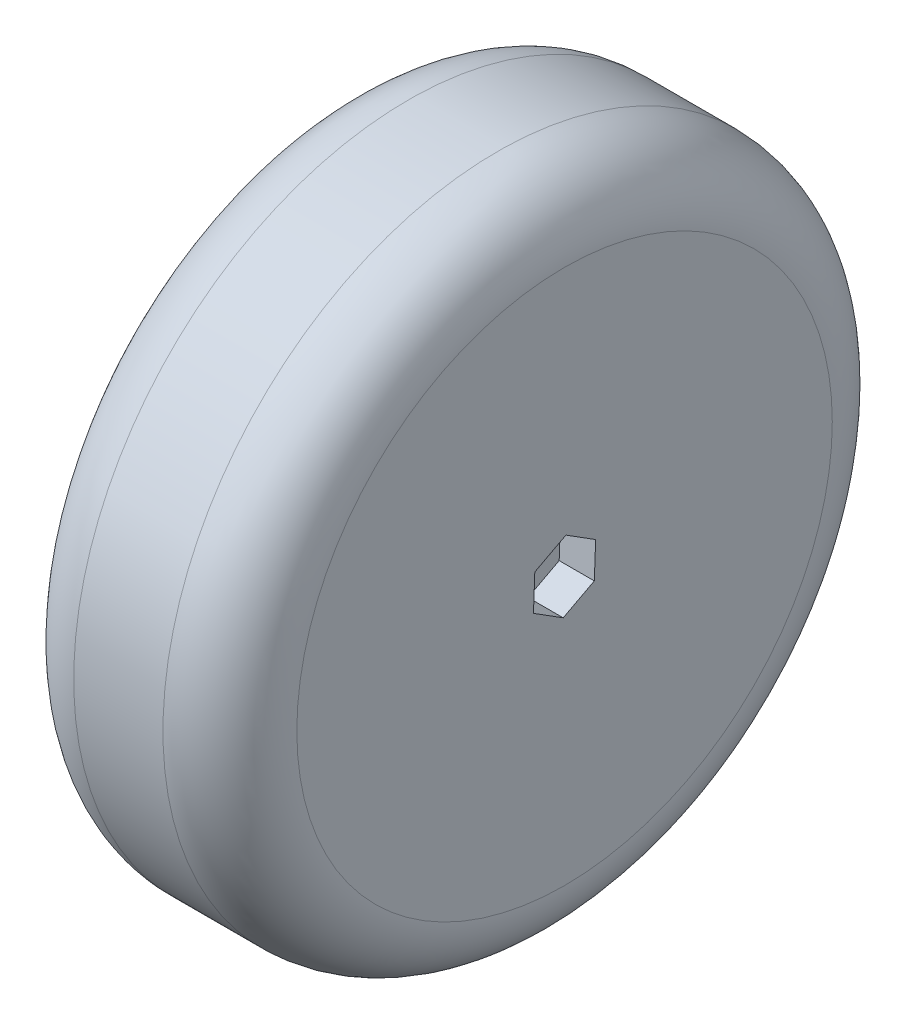
ISO-10303-21;
HEADER;
FILE_DESCRIPTION(('STEP AP214'),'2;1');
FILE_NAME('part.step','',(''),(''),'','','');
FILE_SCHEMA(('AUTOMOTIVE_DESIGN { 1 0 10303 214 1 1 1 1 }'));
ENDSEC;
DATA;
#1=APPLICATION_CONTEXT('core data for automotive mechanical design processes');
#2=APPLICATION_PROTOCOL_DEFINITION('international standard','automotive_design',2000,#1);
#3=PRODUCT_CONTEXT('',#1,'mechanical');
#4=PRODUCT('Part','Part','',(#3));
#5=PRODUCT_RELATED_PRODUCT_CATEGORY('part','',(#4));
#6=PRODUCT_DEFINITION_FORMATION('','',#4);
#7=PRODUCT_DEFINITION_CONTEXT('part definition',#1,'design');
#8=PRODUCT_DEFINITION('design','',#6,#7);
#9=PRODUCT_DEFINITION_SHAPE('','',#8);
#10=(LENGTH_UNIT() NAMED_UNIT(*) SI_UNIT(.MILLI.,.METRE.));
#11=(NAMED_UNIT(*) PLANE_ANGLE_UNIT() SI_UNIT($,.RADIAN.));
#12=(NAMED_UNIT(*) SI_UNIT($,.STERADIAN.) SOLID_ANGLE_UNIT());
#13=UNCERTAINTY_MEASURE_WITH_UNIT(LENGTH_MEASURE(1.E-05),#10,'distance_accuracy_value','');
#14=(GEOMETRIC_REPRESENTATION_CONTEXT(3) GLOBAL_UNCERTAINTY_ASSIGNED_CONTEXT((#13)) GLOBAL_UNIT_ASSIGNED_CONTEXT((#10,
#11,#12)) REPRESENTATION_CONTEXT('',''));
#15=CARTESIAN_POINT('',(0.,0.,0.));
#16=DIRECTION('',(0.,0.,1.));
#17=DIRECTION('',(1.,0.,0.));
#18=AXIS2_PLACEMENT_3D('',#15,#16,#17);
#19=CARTESIAN_POINT('',(0.,0.,0.));
#20=DIRECTION('',(1.,0.,0.));
#21=DIRECTION('',(0.,0.,-1.));
#22=AXIS2_PLACEMENT_3D('',#19,#20,#21);
#23=CYLINDRICAL_SURFACE('',#22,1.7);
#24=CARTESIAN_POINT('',(0.,0.,0.));
#25=DIRECTION('',(1.,0.,0.));
#26=DIRECTION('',(0.,0.,-1.));
#27=AXIS2_PLACEMENT_3D('',#24,#25,#26);
#28=CIRCLE('',#27,1.7);
#29=CARTESIAN_POINT('',(0.,0.,-1.7));
#30=VERTEX_POINT('',#29);
#31=EDGE_CURVE('E171',#30,#30,#28,.T.);
#32=ORIENTED_EDGE('',*,*,#31,.F.);
#33=EDGE_LOOP('',(#32));
#34=FACE_BOUND('',#33,.T.);
#35=CARTESIAN_POINT('',(21.4,0.,0.));
#36=DIRECTION('',(1.,0.,0.));
#37=DIRECTION('',(0.,0.,-1.));
#38=AXIS2_PLACEMENT_3D('',#35,#36,#37);
#39=CIRCLE('',#38,1.7);
#40=CARTESIAN_POINT('',(21.4,0.,-1.7));
#41=VERTEX_POINT('',#40);
#42=EDGE_CURVE('E49',#41,#41,#39,.F.);
#43=ORIENTED_EDGE('',*,*,#42,.F.);
#44=EDGE_LOOP('',(#43));
#45=FACE_BOUND('',#44,.T.);
#46=ADVANCED_FACE('F45',(#34,#45),#23,.F.);
#47=CARTESIAN_POINT('',(25.4,0.,0.));
#48=DIRECTION('',(-1.,0.,0.));
#49=DIRECTION('',(0.,0.,1.));
#50=AXIS2_PLACEMENT_3D('',#47,#48,#49);
#51=CYLINDRICAL_SURFACE('',#50,38.1);
#52=CARTESIAN_POINT('',(7.62,0.,0.));
#53=DIRECTION('',(1.,0.,0.));
#54=DIRECTION('',(0.,0.,-1.));
#55=AXIS2_PLACEMENT_3D('',#52,#53,#54);
#56=CIRCLE('',#55,38.1);
#57=CARTESIAN_POINT('',(7.62,0.,-38.1));
#58=VERTEX_POINT('',#57);
#59=EDGE_CURVE('E55',#58,#58,#56,.T.);
#60=ORIENTED_EDGE('',*,*,#59,.T.);
#61=EDGE_LOOP('',(#60));
#62=FACE_BOUND('',#61,.T.);
#63=CARTESIAN_POINT('',(17.78,0.,0.));
#64=DIRECTION('',(1.,0.,0.));
#65=DIRECTION('',(0.,0.,-1.));
#66=AXIS2_PLACEMENT_3D('',#63,#64,#65);
#67=CIRCLE('',#66,38.1);
#68=CARTESIAN_POINT('',(17.78,0.,-38.1));
#69=VERTEX_POINT('',#68);
#70=EDGE_CURVE('E179',#69,#69,#67,.F.);
#71=ORIENTED_EDGE('',*,*,#70,.T.);
#72=EDGE_LOOP('',(#71));
#73=FACE_BOUND('',#72,.T.);
#74=ADVANCED_FACE('F187',(#62,#73),#51,.T.);
#75=CARTESIAN_POINT('',(25.4,0.,0.));
#76=DIRECTION('',(1.,0.,0.));
#77=DIRECTION('',(0.,0.,-1.));
#78=AXIS2_PLACEMENT_3D('',#75,#76,#77);
#79=PLANE('',#78);
#80=DIRECTION('',(0.,-0.466452502191299,0.884546247066526));
#81=VECTOR('',#80,1.);
#82=CARTESIAN_POINT('',(25.4,3.99983047041812,-0.153359733680597));
#83=LINE('',#82,#81);
#84=CARTESIAN_POINT('',(25.4,3.99983047041812,-0.153359733680597));
#85=VERTEX_POINT('',#84);
#86=CARTESIAN_POINT('',(25.4,2.13272866049408,3.38727493137286));
#87=VERTEX_POINT('',#86);
#88=EDGE_CURVE('E62',#85,#87,#83,.T.);
#89=ORIENTED_EDGE('',*,*,#88,.F.);
#90=DIRECTION('',(0.,0.532813269686149,0.846232840089745));
#91=VECTOR('',#90,1.);
#92=CARTESIAN_POINT('',(25.4,1.86710180992405,-3.54063466505346));
#93=LINE('',#92,#91);
#94=CARTESIAN_POINT('',(25.4,1.86710180992405,-3.54063466505346));
#95=VERTEX_POINT('',#94);
#96=EDGE_CURVE('E156',#95,#85,#93,.T.);
#97=ORIENTED_EDGE('',*,*,#96,.F.);
#98=DIRECTION('',(0.,0.999265771877448,-0.0383134069767816));
#99=VECTOR('',#98,1.);
#100=CARTESIAN_POINT('',(25.4,-2.13272866049408,-3.38727493137286));
#101=LINE('',#100,#99);
#102=CARTESIAN_POINT('',(25.4,-2.13272866049408,-3.38727493137286));
#103=VERTEX_POINT('',#102);
#104=EDGE_CURVE('E153',#103,#95,#101,.T.);
#105=ORIENTED_EDGE('',*,*,#104,.F.);
#106=DIRECTION('',(0.,0.466452502191299,-0.884546247066526));
#107=VECTOR('',#106,1.);
#108=CARTESIAN_POINT('',(25.4,-3.99983047041813,0.153359733680597));
#109=LINE('',#108,#107);
#110=CARTESIAN_POINT('',(25.4,-3.99983047041813,0.153359733680597));
#111=VERTEX_POINT('',#110);
#112=EDGE_CURVE('E110',#111,#103,#109,.T.);
#113=ORIENTED_EDGE('',*,*,#112,.F.);
#114=DIRECTION('',(0.,-0.532813269686149,-0.846232840089745));
#115=VECTOR('',#114,1.);
#116=CARTESIAN_POINT('',(25.4,-1.86710180992405,3.54063466505346));
#117=LINE('',#116,#115);
#118=CARTESIAN_POINT('',(25.4,-1.86710180992405,3.54063466505346));
#119=VERTEX_POINT('',#118);
#120=EDGE_CURVE('E147',#119,#111,#117,.T.);
#121=ORIENTED_EDGE('',*,*,#120,.F.);
#122=DIRECTION('',(0.,-0.999265771877448,0.0383134069767817));
#123=VECTOR('',#122,1.);
#124=CARTESIAN_POINT('',(25.4,2.13272866049408,3.38727493137286));
#125=LINE('',#124,#123);
#126=EDGE_CURVE('E143',#87,#119,#125,.T.);
#127=ORIENTED_EDGE('',*,*,#126,.F.);
#128=EDGE_LOOP('',(#89,#97,#105,#113,#121,#127));
#129=FACE_BOUND('',#128,.T.);
#130=CARTESIAN_POINT('',(25.4,0.,0.));
#131=DIRECTION('',(1.,0.,0.));
#132=DIRECTION('',(0.,0.,-1.));
#133=AXIS2_PLACEMENT_3D('',#130,#131,#132);
#134=CIRCLE('',#133,30.48);
#135=CARTESIAN_POINT('',(25.4,0.,-30.48));
#136=VERTEX_POINT('',#135);
#137=EDGE_CURVE('E175',#136,#136,#134,.T.);
#138=ORIENTED_EDGE('',*,*,#137,.T.);
#139=EDGE_LOOP('',(#138));
#140=FACE_BOUND('',#139,.T.);
#141=ADVANCED_FACE('F210',(#129,#140),#79,.T.);
#142=CARTESIAN_POINT('',(0.,0.,0.));
#143=DIRECTION('',(1.,0.,0.));
#144=DIRECTION('',(0.,0.,-1.));
#145=AXIS2_PLACEMENT_3D('',#142,#143,#144);
#146=PLANE('',#145);
#147=ORIENTED_EDGE('',*,*,#31,.T.);
#148=EDGE_LOOP('',(#147));
#149=FACE_BOUND('',#148,.T.);
#150=CARTESIAN_POINT('',(0.,0.,0.));
#151=DIRECTION('',(1.,0.,0.));
#152=DIRECTION('',(0.,0.,-1.));
#153=AXIS2_PLACEMENT_3D('',#150,#151,#152);
#154=CIRCLE('',#153,30.48);
#155=CARTESIAN_POINT('',(0.,0.,-30.48));
#156=VERTEX_POINT('',#155);
#157=EDGE_CURVE('E11',#156,#156,#154,.F.);
#158=ORIENTED_EDGE('',*,*,#157,.T.);
#159=EDGE_LOOP('',(#158));
#160=FACE_BOUND('',#159,.T.);
#161=ADVANCED_FACE('F201',(#149,#160),#146,.F.);
#162=CARTESIAN_POINT('',(17.78,0.,0.));
#163=DIRECTION('',(1.,0.,0.));
#164=DIRECTION('',(0.,0.,-1.));
#165=AXIS2_PLACEMENT_3D('',#162,#163,#164);
#166=TOROIDAL_SURFACE('',#165,30.48,7.62);
#167=ORIENTED_EDGE('',*,*,#70,.F.);
#168=EDGE_LOOP('',(#167));
#169=FACE_BOUND('',#168,.T.);
#170=ORIENTED_EDGE('',*,*,#137,.F.);
#171=EDGE_LOOP('',(#170));
#172=FACE_BOUND('',#171,.T.);
#173=ADVANCED_FACE('F191',(#169,#172),#166,.T.);
#174=CARTESIAN_POINT('',(7.62,0.,0.));
#175=DIRECTION('',(1.,0.,0.));
#176=DIRECTION('',(0.,0.,-1.));
#177=AXIS2_PLACEMENT_3D('',#174,#175,#176);
#178=TOROIDAL_SURFACE('',#177,30.48,7.62);
#179=ORIENTED_EDGE('',*,*,#157,.F.);
#180=EDGE_LOOP('',(#179));
#181=FACE_BOUND('',#180,.T.);
#182=ORIENTED_EDGE('',*,*,#59,.F.);
#183=EDGE_LOOP('',(#182));
#184=FACE_BOUND('',#183,.T.);
#185=ADVANCED_FACE('F47',(#181,#184),#178,.T.);
#186=CARTESIAN_POINT('',(21.4,0.,0.));
#187=DIRECTION('',(1.,0.,0.));
#188=DIRECTION('',(0.,0.,-1.));
#189=AXIS2_PLACEMENT_3D('',#186,#187,#188);
#190=PLANE('',#189);
#191=DIRECTION('',(0.,-0.466452502191299,0.884546247066526));
#192=VECTOR('',#191,1.);
#193=CARTESIAN_POINT('',(21.4,3.99983047041812,-0.153359733680597));
#194=LINE('',#193,#192);
#195=CARTESIAN_POINT('',(21.4,3.99983047041812,-0.153359733680597));
#196=VERTEX_POINT('',#195);
#197=CARTESIAN_POINT('',(21.4,2.13272866049408,3.38727493137286));
#198=VERTEX_POINT('',#197);
#199=EDGE_CURVE('E159',#196,#198,#194,.T.);
#200=ORIENTED_EDGE('',*,*,#199,.T.);
#201=DIRECTION('',(0.,-0.999265771877448,0.0383134069767817));
#202=VECTOR('',#201,1.);
#203=CARTESIAN_POINT('',(21.4,2.13272866049408,3.38727493137286));
#204=LINE('',#203,#202);
#205=CARTESIAN_POINT('',(21.4,-1.86710180992405,3.54063466505346));
#206=VERTEX_POINT('',#205);
#207=EDGE_CURVE('E135',#198,#206,#204,.T.);
#208=ORIENTED_EDGE('',*,*,#207,.T.);
#209=DIRECTION('',(0.,-0.532813269686149,-0.846232840089745));
#210=VECTOR('',#209,1.);
#211=CARTESIAN_POINT('',(21.4,-1.86710180992405,3.54063466505346));
#212=LINE('',#211,#210);
#213=CARTESIAN_POINT('',(21.4,-3.99983047041813,0.153359733680597));
#214=VERTEX_POINT('',#213);
#215=EDGE_CURVE('E131',#206,#214,#212,.T.);
#216=ORIENTED_EDGE('',*,*,#215,.T.);
#217=DIRECTION('',(0.,0.466452502191299,-0.884546247066526));
#218=VECTOR('',#217,1.);
#219=CARTESIAN_POINT('',(21.4,-3.99983047041813,0.153359733680597));
#220=LINE('',#219,#218);
#221=CARTESIAN_POINT('',(21.4,-2.13272866049408,-3.38727493137286));
#222=VERTEX_POINT('',#221);
#223=EDGE_CURVE('E107',#214,#222,#220,.T.);
#224=ORIENTED_EDGE('',*,*,#223,.T.);
#225=DIRECTION('',(0.,0.999265771877448,-0.0383134069767816));
#226=VECTOR('',#225,1.);
#227=CARTESIAN_POINT('',(21.4,-2.13272866049408,-3.38727493137286));
#228=LINE('',#227,#226);
#229=CARTESIAN_POINT('',(21.4,1.86710180992405,-3.54063466505346));
#230=VERTEX_POINT('',#229);
#231=EDGE_CURVE('E119',#222,#230,#228,.T.);
#232=ORIENTED_EDGE('',*,*,#231,.T.);
#233=DIRECTION('',(0.,0.532813269686149,0.846232840089745));
#234=VECTOR('',#233,1.);
#235=CARTESIAN_POINT('',(21.4,1.86710180992405,-3.54063466505346));
#236=LINE('',#235,#234);
#237=EDGE_CURVE('E124',#230,#196,#236,.T.);
#238=ORIENTED_EDGE('',*,*,#237,.T.);
#239=EDGE_LOOP('',(#200,#208,#216,#224,#232,#238));
#240=FACE_BOUND('',#239,.T.);
#241=ORIENTED_EDGE('',*,*,#42,.T.);
#242=EDGE_LOOP('',(#241));
#243=FACE_BOUND('',#242,.T.);
#244=ADVANCED_FACE('F127',(#240,#243),#190,.T.);
#245=CARTESIAN_POINT('',(21.4,3.99983047041812,-0.153359733680597));
#246=DIRECTION('',(0.,0.884546247066527,0.466452502191299));
#247=DIRECTION('',(0.,-0.466452502191299,0.884546247066527));
#248=AXIS2_PLACEMENT_3D('',#245,#246,#247);
#249=PLANE('',#248);
#250=ORIENTED_EDGE('',*,*,#88,.T.);
#251=DIRECTION('',(1.,0.,0.));
#252=VECTOR('',#251,1.);
#253=CARTESIAN_POINT('',(21.4,2.13272866049408,3.38727493137286));
#254=LINE('',#253,#252);
#255=EDGE_CURVE('E92',#198,#87,#254,.T.);
#256=ORIENTED_EDGE('',*,*,#255,.F.);
#257=ORIENTED_EDGE('',*,*,#199,.F.);
#258=DIRECTION('',(1.,0.,0.));
#259=VECTOR('',#258,1.);
#260=CARTESIAN_POINT('',(21.4,3.99983047041812,-0.153359733680597));
#261=LINE('',#260,#259);
#262=EDGE_CURVE('E70',#196,#85,#261,.T.);
#263=ORIENTED_EDGE('',*,*,#262,.T.);
#264=EDGE_LOOP('',(#250,#256,#257,#263));
#265=FACE_BOUND('',#264,.T.);
#266=ADVANCED_FACE('F198',(#265),#249,.F.);
#267=CARTESIAN_POINT('',(21.4,1.86710180992405,-3.54063466505346));
#268=DIRECTION('',(0.,0.846232840089745,-0.532813269686149));
#269=DIRECTION('',(0.,0.532813269686149,0.846232840089745));
#270=AXIS2_PLACEMENT_3D('',#267,#268,#269);
#271=PLANE('',#270);
#272=ORIENTED_EDGE('',*,*,#96,.T.);
#273=ORIENTED_EDGE('',*,*,#262,.F.);
#274=ORIENTED_EDGE('',*,*,#237,.F.);
#275=DIRECTION('',(1.,0.,0.));
#276=VECTOR('',#275,1.);
#277=CARTESIAN_POINT('',(21.4,1.86710180992405,-3.54063466505346));
#278=LINE('',#277,#276);
#279=EDGE_CURVE('E115',#230,#95,#278,.T.);
#280=ORIENTED_EDGE('',*,*,#279,.T.);
#281=EDGE_LOOP('',(#272,#273,#274,#280));
#282=FACE_BOUND('',#281,.T.);
#283=ADVANCED_FACE('F258',(#282),#271,.F.);
#284=CARTESIAN_POINT('',(21.4,-2.13272866049408,-3.38727493137286));
#285=DIRECTION('',(0.,-0.0383134069767816,-0.999265771877448));
#286=DIRECTION('',(0.,0.999265771877448,-0.0383134069767816));
#287=AXIS2_PLACEMENT_3D('',#284,#285,#286);
#288=PLANE('',#287);
#289=ORIENTED_EDGE('',*,*,#104,.T.);
#290=ORIENTED_EDGE('',*,*,#279,.F.);
#291=ORIENTED_EDGE('',*,*,#231,.F.);
#292=DIRECTION('',(1.,0.,0.));
#293=VECTOR('',#292,1.);
#294=CARTESIAN_POINT('',(21.4,-2.13272866049408,-3.38727493137286));
#295=LINE('',#294,#293);
#296=EDGE_CURVE('E103',#222,#103,#295,.T.);
#297=ORIENTED_EDGE('',*,*,#296,.T.);
#298=EDGE_LOOP('',(#289,#290,#291,#297));
#299=FACE_BOUND('',#298,.T.);
#300=ADVANCED_FACE('F120',(#299),#288,.F.);
#301=CARTESIAN_POINT('',(21.4,-3.99983047041813,0.153359733680597));
#302=DIRECTION('',(0.,-0.884546247066527,-0.466452502191299));
#303=DIRECTION('',(0.,0.466452502191299,-0.884546247066526));
#304=AXIS2_PLACEMENT_3D('',#301,#302,#303);
#305=PLANE('',#304);
#306=ORIENTED_EDGE('',*,*,#112,.T.);
#307=ORIENTED_EDGE('',*,*,#296,.F.);
#308=ORIENTED_EDGE('',*,*,#223,.F.);
#309=DIRECTION('',(1.,0.,0.));
#310=VECTOR('',#309,1.);
#311=CARTESIAN_POINT('',(21.4,-3.99983047041813,0.153359733680597));
#312=LINE('',#311,#310);
#313=EDGE_CURVE('E116',#214,#111,#312,.T.);
#314=ORIENTED_EDGE('',*,*,#313,.T.);
#315=EDGE_LOOP('',(#306,#307,#308,#314));
#316=FACE_BOUND('',#315,.T.);
#317=ADVANCED_FACE('F105',(#316),#305,.F.);
#318=CARTESIAN_POINT('',(21.4,-1.86710180992405,3.54063466505346));
#319=DIRECTION('',(0.,-0.846232840089745,0.532813269686149));
#320=DIRECTION('',(0.,-0.532813269686149,-0.846232840089745));
#321=AXIS2_PLACEMENT_3D('',#318,#319,#320);
#322=PLANE('',#321);
#323=ORIENTED_EDGE('',*,*,#120,.T.);
#324=ORIENTED_EDGE('',*,*,#313,.F.);
#325=ORIENTED_EDGE('',*,*,#215,.F.);
#326=DIRECTION('',(1.,0.,0.));
#327=VECTOR('',#326,1.);
#328=CARTESIAN_POINT('',(21.4,-1.86710180992405,3.54063466505346));
#329=LINE('',#328,#327);
#330=EDGE_CURVE('E166',#206,#119,#329,.T.);
#331=ORIENTED_EDGE('',*,*,#330,.T.);
#332=EDGE_LOOP('',(#323,#324,#325,#331));
#333=FACE_BOUND('',#332,.T.);
#334=ADVANCED_FACE('F282',(#333),#322,.F.);
#335=CARTESIAN_POINT('',(21.4,2.13272866049408,3.38727493137286));
#336=DIRECTION('',(0.,0.0383134069767817,0.999265771877448));
#337=DIRECTION('',(0.,-0.999265771877448,0.0383134069767817));
#338=AXIS2_PLACEMENT_3D('',#335,#336,#337);
#339=PLANE('',#338);
#340=ORIENTED_EDGE('',*,*,#126,.T.);
#341=ORIENTED_EDGE('',*,*,#330,.F.);
#342=ORIENTED_EDGE('',*,*,#207,.F.);
#343=ORIENTED_EDGE('',*,*,#255,.T.);
#344=EDGE_LOOP('',(#340,#341,#342,#343));
#345=FACE_BOUND('',#344,.T.);
#346=ADVANCED_FACE('F291',(#345),#339,.F.);
#347=CLOSED_SHELL('',(#46,#74,#141,#161,#173,#185,#244,#266,#283,#300,#317,#334,#346));
#348=MANIFOLD_SOLID_BREP('B2',#347);
#349=ADVANCED_BREP_SHAPE_REPRESENTATION('',(#18,#348),#14);
#350=SHAPE_DEFINITION_REPRESENTATION(#9,#349);
ENDSEC;
END-ISO-10303-21;
